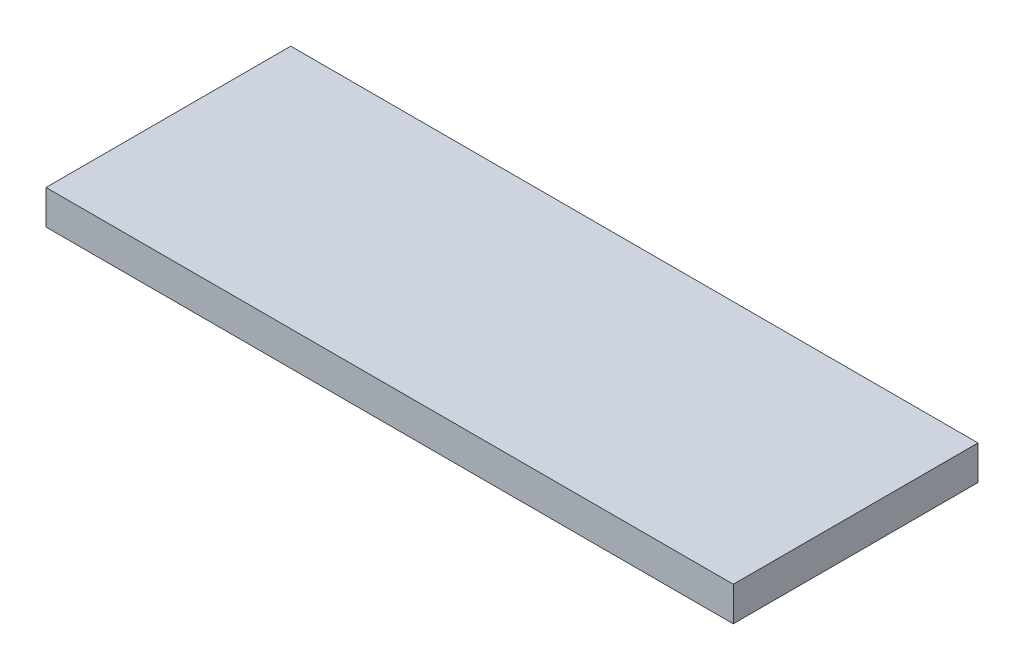
ISO-10303-21;
HEADER;
FILE_DESCRIPTION(('STEP AP214'),'2;1');
FILE_NAME('part.step','',(''),(''),'','','');
FILE_SCHEMA(('AUTOMOTIVE_DESIGN { 1 0 10303 214 1 1 1 1 }'));
ENDSEC;
DATA;
#1=APPLICATION_CONTEXT('core data for automotive mechanical design processes');
#2=APPLICATION_PROTOCOL_DEFINITION('international standard','automotive_design',2000,#1);
#3=PRODUCT_CONTEXT('',#1,'mechanical');
#4=PRODUCT('Part','Part','',(#3));
#5=PRODUCT_RELATED_PRODUCT_CATEGORY('part','',(#4));
#6=PRODUCT_DEFINITION_FORMATION('','',#4);
#7=PRODUCT_DEFINITION_CONTEXT('part definition',#1,'design');
#8=PRODUCT_DEFINITION('design','',#6,#7);
#9=PRODUCT_DEFINITION_SHAPE('','',#8);
#10=(LENGTH_UNIT() NAMED_UNIT(*) SI_UNIT(.MILLI.,.METRE.));
#11=(NAMED_UNIT(*) PLANE_ANGLE_UNIT() SI_UNIT($,.RADIAN.));
#12=(NAMED_UNIT(*) SI_UNIT($,.STERADIAN.) SOLID_ANGLE_UNIT());
#13=UNCERTAINTY_MEASURE_WITH_UNIT(LENGTH_MEASURE(1.E-05),#10,'distance_accuracy_value','');
#14=(GEOMETRIC_REPRESENTATION_CONTEXT(3) GLOBAL_UNCERTAINTY_ASSIGNED_CONTEXT((#13)) GLOBAL_UNIT_ASSIGNED_CONTEXT((#10,
#11,#12)) REPRESENTATION_CONTEXT('',''));
#15=CARTESIAN_POINT('',(0.,0.,0.));
#16=DIRECTION('',(0.,0.,1.));
#17=DIRECTION('',(1.,0.,0.));
#18=AXIS2_PLACEMENT_3D('',#15,#16,#17);
#19=CARTESIAN_POINT('',(-101.809293118019,10.16,36.2531246711766));
#20=DIRECTION('',(1.,0.,0.));
#21=DIRECTION('',(0.,0.,-1.));
#22=AXIS2_PLACEMENT_3D('',#19,#20,#21);
#23=PLANE('',#22);
#24=DIRECTION('',(0.,0.,1.));
#25=VECTOR('',#24,1.);
#26=CARTESIAN_POINT('',(-101.809293118019,0.,36.2531246711766));
#27=LINE('',#26,#25);
#28=CARTESIAN_POINT('',(-101.809293118019,0.,-36.2531246711766));
#29=VERTEX_POINT('',#28);
#30=CARTESIAN_POINT('',(-101.809293118019,0.,36.2531246711766));
#31=VERTEX_POINT('',#30);
#32=EDGE_CURVE('E100',#29,#31,#27,.T.);
#33=ORIENTED_EDGE('',*,*,#32,.T.);
#34=DIRECTION('',(0.,-1.,0.));
#35=VECTOR('',#34,1.);
#36=CARTESIAN_POINT('',(-101.809293118019,10.16,36.2531246711766));
#37=LINE('',#36,#35);
#38=CARTESIAN_POINT('',(-101.809293118019,10.16,36.2531246711766));
#39=VERTEX_POINT('',#38);
#40=EDGE_CURVE('E11',#39,#31,#37,.T.);
#41=ORIENTED_EDGE('',*,*,#40,.F.);
#42=DIRECTION('',(0.,0.,1.));
#43=VECTOR('',#42,1.);
#44=CARTESIAN_POINT('',(-101.809293118019,10.16,36.2531246711766));
#45=LINE('',#44,#43);
#46=CARTESIAN_POINT('',(-101.809293118019,10.16,-36.2531246711766));
#47=VERTEX_POINT('',#46);
#48=EDGE_CURVE('E88',#47,#39,#45,.T.);
#49=ORIENTED_EDGE('',*,*,#48,.F.);
#50=DIRECTION('',(0.,-1.,0.));
#51=VECTOR('',#50,1.);
#52=CARTESIAN_POINT('',(-101.809293118019,10.16,-36.2531246711766));
#53=LINE('',#52,#51);
#54=EDGE_CURVE('E96',#47,#29,#53,.T.);
#55=ORIENTED_EDGE('',*,*,#54,.T.);
#56=EDGE_LOOP('',(#33,#41,#49,#55));
#57=FACE_BOUND('',#56,.T.);
#58=ADVANCED_FACE('F37',(#57),#23,.F.);
#59=CARTESIAN_POINT('',(101.809293118019,10.16,36.2531246711766));
#60=DIRECTION('',(0.,0.,-1.));
#61=DIRECTION('',(-1.,0.,0.));
#62=AXIS2_PLACEMENT_3D('',#59,#60,#61);
#63=PLANE('',#62);
#64=DIRECTION('',(1.,0.,0.));
#65=VECTOR('',#64,1.);
#66=CARTESIAN_POINT('',(101.809293118019,0.,36.2531246711766));
#67=LINE('',#66,#65);
#68=CARTESIAN_POINT('',(101.809293118019,0.,36.2531246711766));
#69=VERTEX_POINT('',#68);
#70=EDGE_CURVE('E92',#31,#69,#67,.T.);
#71=ORIENTED_EDGE('',*,*,#70,.T.);
#72=DIRECTION('',(0.,-1.,0.));
#73=VECTOR('',#72,1.);
#74=CARTESIAN_POINT('',(101.809293118019,10.16,36.2531246711766));
#75=LINE('',#74,#73);
#76=CARTESIAN_POINT('',(101.809293118019,10.16,36.2531246711766));
#77=VERTEX_POINT('',#76);
#78=EDGE_CURVE('E45',#77,#69,#75,.T.);
#79=ORIENTED_EDGE('',*,*,#78,.F.);
#80=DIRECTION('',(1.,0.,0.));
#81=VECTOR('',#80,1.);
#82=CARTESIAN_POINT('',(101.809293118019,10.16,36.2531246711766));
#83=LINE('',#82,#81);
#84=EDGE_CURVE('E83',#39,#77,#83,.T.);
#85=ORIENTED_EDGE('',*,*,#84,.F.);
#86=ORIENTED_EDGE('',*,*,#40,.T.);
#87=EDGE_LOOP('',(#71,#79,#85,#86));
#88=FACE_BOUND('',#87,.T.);
#89=ADVANCED_FACE('F91',(#88),#63,.F.);
#90=CARTESIAN_POINT('',(101.809293118019,10.16,36.2531246711766));
#91=DIRECTION('',(-1.,0.,0.));
#92=DIRECTION('',(0.,0.,1.));
#93=AXIS2_PLACEMENT_3D('',#90,#91,#92);
#94=PLANE('',#93);
#95=DIRECTION('',(0.,0.,-1.));
#96=VECTOR('',#95,1.);
#97=CARTESIAN_POINT('',(101.809293118019,0.,36.2531246711766));
#98=LINE('',#97,#96);
#99=CARTESIAN_POINT('',(101.809293118019,0.,-36.2531246711766));
#100=VERTEX_POINT('',#99);
#101=EDGE_CURVE('E70',#69,#100,#98,.T.);
#102=ORIENTED_EDGE('',*,*,#101,.T.);
#103=DIRECTION('',(0.,-1.,0.));
#104=VECTOR('',#103,1.);
#105=CARTESIAN_POINT('',(101.809293118019,10.16,-36.2531246711766));
#106=LINE('',#105,#104);
#107=CARTESIAN_POINT('',(101.809293118019,10.16,-36.2531246711766));
#108=VERTEX_POINT('',#107);
#109=EDGE_CURVE('E93',#108,#100,#106,.T.);
#110=ORIENTED_EDGE('',*,*,#109,.F.);
#111=DIRECTION('',(0.,0.,-1.));
#112=VECTOR('',#111,1.);
#113=CARTESIAN_POINT('',(101.809293118019,10.16,36.2531246711766));
#114=LINE('',#113,#112);
#115=EDGE_CURVE('E86',#77,#108,#114,.T.);
#116=ORIENTED_EDGE('',*,*,#115,.F.);
#117=ORIENTED_EDGE('',*,*,#78,.T.);
#118=EDGE_LOOP('',(#102,#110,#116,#117));
#119=FACE_BOUND('',#118,.T.);
#120=ADVANCED_FACE('F94',(#119),#94,.F.);
#121=CARTESIAN_POINT('',(101.809293118019,10.16,-36.2531246711766));
#122=DIRECTION('',(0.,0.,1.));
#123=DIRECTION('',(1.,0.,0.));
#124=AXIS2_PLACEMENT_3D('',#121,#122,#123);
#125=PLANE('',#124);
#126=DIRECTION('',(-1.,0.,0.));
#127=VECTOR('',#126,1.);
#128=CARTESIAN_POINT('',(101.809293118019,0.,-36.2531246711766));
#129=LINE('',#128,#127);
#130=EDGE_CURVE('E76',#100,#29,#129,.T.);
#131=ORIENTED_EDGE('',*,*,#130,.T.);
#132=ORIENTED_EDGE('',*,*,#54,.F.);
#133=DIRECTION('',(-1.,0.,0.));
#134=VECTOR('',#133,1.);
#135=CARTESIAN_POINT('',(101.809293118019,10.16,-36.2531246711766));
#136=LINE('',#135,#134);
#137=EDGE_CURVE('E53',#108,#47,#136,.T.);
#138=ORIENTED_EDGE('',*,*,#137,.F.);
#139=ORIENTED_EDGE('',*,*,#109,.T.);
#140=EDGE_LOOP('',(#131,#132,#138,#139));
#141=FACE_BOUND('',#140,.T.);
#142=ADVANCED_FACE('F107',(#141),#125,.F.);
#143=CARTESIAN_POINT('',(0.,10.16,0.));
#144=DIRECTION('',(0.,1.,0.));
#145=DIRECTION('',(0.,0.,1.));
#146=AXIS2_PLACEMENT_3D('',#143,#144,#145);
#147=PLANE('',#146);
#148=ORIENTED_EDGE('',*,*,#48,.T.);
#149=ORIENTED_EDGE('',*,*,#84,.T.);
#150=ORIENTED_EDGE('',*,*,#115,.T.);
#151=ORIENTED_EDGE('',*,*,#137,.T.);
#152=EDGE_LOOP('',(#148,#149,#150,#151));
#153=FACE_BOUND('',#152,.T.);
#154=ADVANCED_FACE('F84',(#153),#147,.T.);
#155=CARTESIAN_POINT('',(0.,0.,0.));
#156=DIRECTION('',(0.,1.,0.));
#157=DIRECTION('',(0.,0.,1.));
#158=AXIS2_PLACEMENT_3D('',#155,#156,#157);
#159=PLANE('',#158);
#160=ORIENTED_EDGE('',*,*,#32,.F.);
#161=ORIENTED_EDGE('',*,*,#130,.F.);
#162=ORIENTED_EDGE('',*,*,#101,.F.);
#163=ORIENTED_EDGE('',*,*,#70,.F.);
#164=EDGE_LOOP('',(#160,#161,#162,#163));
#165=FACE_BOUND('',#164,.T.);
#166=ADVANCED_FACE('F110',(#165),#159,.F.);
#167=CLOSED_SHELL('',(#58,#89,#120,#142,#154,#166));
#168=MANIFOLD_SOLID_BREP('B2',#167);
#169=ADVANCED_BREP_SHAPE_REPRESENTATION('',(#18,#168),#14);
#170=SHAPE_DEFINITION_REPRESENTATION(#9,#169);
ENDSEC;
END-ISO-10303-21;
